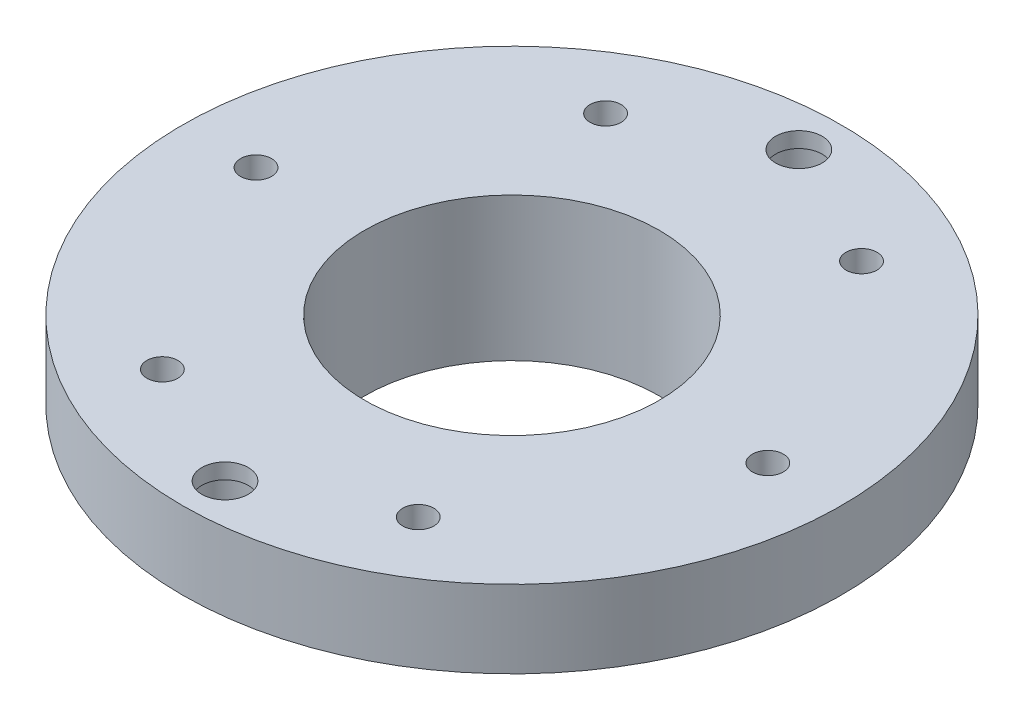
ISO-10303-21;
HEADER;
FILE_DESCRIPTION(('STEP AP214'),'2;1');
FILE_NAME('part.step','',(''),(''),'','','');
FILE_SCHEMA(('AUTOMOTIVE_DESIGN { 1 0 10303 214 1 1 1 1 }'));
ENDSEC;
DATA;
#1=APPLICATION_CONTEXT('core data for automotive mechanical design processes');
#2=APPLICATION_PROTOCOL_DEFINITION('international standard','automotive_design',2000,#1);
#3=PRODUCT_CONTEXT('',#1,'mechanical');
#4=PRODUCT('Part','Part','',(#3));
#5=PRODUCT_RELATED_PRODUCT_CATEGORY('part','',(#4));
#6=PRODUCT_DEFINITION_FORMATION('','',#4);
#7=PRODUCT_DEFINITION_CONTEXT('part definition',#1,'design');
#8=PRODUCT_DEFINITION('design','',#6,#7);
#9=PRODUCT_DEFINITION_SHAPE('','',#8);
#10=(LENGTH_UNIT() NAMED_UNIT(*) SI_UNIT(.MILLI.,.METRE.));
#11=(NAMED_UNIT(*) PLANE_ANGLE_UNIT() SI_UNIT($,.RADIAN.));
#12=(NAMED_UNIT(*) SI_UNIT($,.STERADIAN.) SOLID_ANGLE_UNIT());
#13=UNCERTAINTY_MEASURE_WITH_UNIT(LENGTH_MEASURE(1.E-05),#10,'distance_accuracy_value','');
#14=(GEOMETRIC_REPRESENTATION_CONTEXT(3) GLOBAL_UNCERTAINTY_ASSIGNED_CONTEXT((#13)) GLOBAL_UNIT_ASSIGNED_CONTEXT((#10,
#11,#12)) REPRESENTATION_CONTEXT('',''));
#15=CARTESIAN_POINT('',(0.,0.,0.));
#16=DIRECTION('',(0.,0.,1.));
#17=DIRECTION('',(1.,0.,0.));
#18=AXIS2_PLACEMENT_3D('',#15,#16,#17);
#19=CARTESIAN_POINT('',(0.,-4.24264068711929,18.5));
#20=DIRECTION('',(0.,1.,0.));
#21=DIRECTION('',(0.,0.,1.));
#22=AXIS2_PLACEMENT_3D('',#19,#20,#21);
#23=CYLINDRICAL_SURFACE('',#22,1.5);
#24=CARTESIAN_POINT('',(0.,5.,18.5));
#25=DIRECTION('',(0.,1.,0.));
#26=DIRECTION('',(0.,0.,-1.));
#27=AXIS2_PLACEMENT_3D('',#24,#25,#26);
#28=CIRCLE('',#27,1.5);
#29=CARTESIAN_POINT('',(0.,5.,17.));
#30=VERTEX_POINT('',#29);
#31=EDGE_CURVE('E61',#30,#30,#28,.T.);
#32=ORIENTED_EDGE('',*,*,#31,.T.);
#33=EDGE_LOOP('',(#32));
#34=FACE_BOUND('',#33,.T.);
#35=CARTESIAN_POINT('',(0.,4.,18.5));
#36=DIRECTION('',(0.,-1.,0.));
#37=DIRECTION('',(0.,0.,-1.));
#38=AXIS2_PLACEMENT_3D('',#35,#36,#37);
#39=CIRCLE('',#38,1.5);
#40=CARTESIAN_POINT('',(0.,4.,17.));
#41=VERTEX_POINT('',#40);
#42=EDGE_CURVE('E58',#41,#41,#39,.F.);
#43=ORIENTED_EDGE('',*,*,#42,.F.);
#44=EDGE_LOOP('',(#43));
#45=FACE_BOUND('',#44,.T.);
#46=ADVANCED_FACE('F39',(#34,#45),#23,.F.);
#47=CARTESIAN_POINT('',(0.,-4.24264068711929,-18.5));
#48=DIRECTION('',(0.,1.,0.));
#49=DIRECTION('',(0.,0.,1.));
#50=AXIS2_PLACEMENT_3D('',#47,#48,#49);
#51=CYLINDRICAL_SURFACE('',#50,1.5);
#52=CARTESIAN_POINT('',(0.,5.,-18.5));
#53=DIRECTION('',(0.,1.,0.));
#54=DIRECTION('',(0.,0.,1.));
#55=AXIS2_PLACEMENT_3D('',#52,#53,#54);
#56=CIRCLE('',#55,1.5);
#57=CARTESIAN_POINT('',(0.,5.,-17.));
#58=VERTEX_POINT('',#57);
#59=EDGE_CURVE('E66',#58,#58,#56,.T.);
#60=ORIENTED_EDGE('',*,*,#59,.T.);
#61=EDGE_LOOP('',(#60));
#62=FACE_BOUND('',#61,.T.);
#63=CARTESIAN_POINT('',(0.,4.,-18.5));
#64=DIRECTION('',(0.,-1.,0.));
#65=DIRECTION('',(0.,0.,-1.));
#66=AXIS2_PLACEMENT_3D('',#63,#64,#65);
#67=CIRCLE('',#66,1.5);
#68=CARTESIAN_POINT('',(0.,4.,-20.));
#69=VERTEX_POINT('',#68);
#70=EDGE_CURVE('E63',#69,#69,#67,.F.);
#71=ORIENTED_EDGE('',*,*,#70,.F.);
#72=EDGE_LOOP('',(#71));
#73=FACE_BOUND('',#72,.T.);
#74=ADVANCED_FACE('F171',(#62,#73),#51,.F.);
#75=CARTESIAN_POINT('',(0.,5.,0.));
#76=DIRECTION('',(0.,-1.,0.));
#77=DIRECTION('',(0.,0.,-1.));
#78=AXIS2_PLACEMENT_3D('',#75,#76,#77);
#79=CYLINDRICAL_SURFACE('',#78,21.25);
#80=CARTESIAN_POINT('',(0.,5.,0.));
#81=DIRECTION('',(0.,1.,0.));
#82=DIRECTION('',(0.,0.,1.));
#83=AXIS2_PLACEMENT_3D('',#80,#81,#82);
#84=CIRCLE('',#83,21.25);
#85=CARTESIAN_POINT('',(0.,5.,21.25));
#86=VERTEX_POINT('',#85);
#87=EDGE_CURVE('E71',#86,#86,#84,.T.);
#88=ORIENTED_EDGE('',*,*,#87,.F.);
#89=EDGE_LOOP('',(#88));
#90=FACE_BOUND('',#89,.T.);
#91=CARTESIAN_POINT('',(0.,0.,0.));
#92=DIRECTION('',(0.,1.,0.));
#93=DIRECTION('',(0.,0.,1.));
#94=AXIS2_PLACEMENT_3D('',#91,#92,#93);
#95=CIRCLE('',#94,21.25);
#96=CARTESIAN_POINT('',(0.,0.,21.25));
#97=VERTEX_POINT('',#96);
#98=EDGE_CURVE('E68',#97,#97,#95,.T.);
#99=ORIENTED_EDGE('',*,*,#98,.T.);
#100=EDGE_LOOP('',(#99));
#101=FACE_BOUND('',#100,.T.);
#102=ADVANCED_FACE('F149',(#90,#101),#79,.T.);
#103=CARTESIAN_POINT('',(0.,5.,0.));
#104=DIRECTION('',(0.,1.,0.));
#105=DIRECTION('',(0.,0.,1.));
#106=AXIS2_PLACEMENT_3D('',#103,#104,#105);
#107=PLANE('',#106);
#108=CARTESIAN_POINT('',(-8.25000000000012,5.,-14.2894191624432));
#109=DIRECTION('',(0.,1.,0.));
#110=DIRECTION('',(0.86602540378444,0.,0.499999999999998));
#111=AXIS2_PLACEMENT_3D('',#108,#109,#110);
#112=CIRCLE('',#111,1.);
#113=CARTESIAN_POINT('',(-7.38397459621568,5.,-13.7894191624432));
#114=VERTEX_POINT('',#113);
#115=EDGE_CURVE('E130',#114,#114,#112,.T.);
#116=ORIENTED_EDGE('',*,*,#115,.F.);
#117=EDGE_LOOP('',(#116));
#118=FACE_BOUND('',#117,.T.);
#119=CARTESIAN_POINT('',(-16.5,5.,1.80411241501588E-13));
#120=DIRECTION('',(0.,1.,0.));
#121=DIRECTION('',(0.866025403784436,0.,-0.500000000000004));
#122=AXIS2_PLACEMENT_3D('',#119,#120,#121);
#123=CIRCLE('',#122,1.);
#124=CARTESIAN_POINT('',(-15.6339745962156,5.,-0.499999999999825));
#125=VERTEX_POINT('',#124);
#126=EDGE_CURVE('E124',#125,#125,#123,.T.);
#127=ORIENTED_EDGE('',*,*,#126,.F.);
#128=EDGE_LOOP('',(#127));
#129=FACE_BOUND('',#128,.T.);
#130=CARTESIAN_POINT('',(-8.24999999999991,5.,14.2894191624433));
#131=DIRECTION('',(0.,1.,0.));
#132=DIRECTION('',(0.,0.,-1.));
#133=AXIS2_PLACEMENT_3D('',#130,#131,#132);
#134=CIRCLE('',#133,1.);
#135=CARTESIAN_POINT('',(-8.24999999999991,5.,13.2894191624433));
#136=VERTEX_POINT('',#135);
#137=EDGE_CURVE('E118',#136,#136,#134,.T.);
#138=ORIENTED_EDGE('',*,*,#137,.F.);
#139=EDGE_LOOP('',(#138));
#140=FACE_BOUND('',#139,.T.);
#141=CARTESIAN_POINT('',(8.25000000000022,5.,14.2894191624431));
#142=DIRECTION('',(0.,1.,0.));
#143=DIRECTION('',(-0.866025403784443,0.,-0.499999999999992));
#144=AXIS2_PLACEMENT_3D('',#141,#142,#143);
#145=CIRCLE('',#144,1.);
#146=CARTESIAN_POINT('',(7.38397459621578,5.,13.7894191624431));
#147=VERTEX_POINT('',#146);
#148=EDGE_CURVE('E112',#147,#147,#145,.T.);
#149=ORIENTED_EDGE('',*,*,#148,.F.);
#150=EDGE_LOOP('',(#149));
#151=FACE_BOUND('',#150,.T.);
#152=CARTESIAN_POINT('',(16.5,5.,-2.95770352654046E-13));
#153=DIRECTION('',(0.,1.,0.));
#154=DIRECTION('',(-0.866025403784433,0.,0.50000000000001));
#155=AXIS2_PLACEMENT_3D('',#152,#153,#154);
#156=CIRCLE('',#155,1.);
#157=CARTESIAN_POINT('',(15.6339745962156,5.,0.499999999999716));
#158=VERTEX_POINT('',#157);
#159=EDGE_CURVE('E106',#158,#158,#156,.T.);
#160=ORIENTED_EDGE('',*,*,#159,.F.);
#161=EDGE_LOOP('',(#160));
#162=FACE_BOUND('',#161,.T.);
#163=CARTESIAN_POINT('',(8.24999999999991,5.,-14.2894191624433));
#164=DIRECTION('',(0.,1.,0.));
#165=DIRECTION('',(0.,0.,1.));
#166=AXIS2_PLACEMENT_3D('',#163,#164,#165);
#167=CIRCLE('',#166,1.);
#168=CARTESIAN_POINT('',(8.24999999999991,5.,-13.2894191624433));
#169=VERTEX_POINT('',#168);
#170=EDGE_CURVE('E100',#169,#169,#167,.T.);
#171=ORIENTED_EDGE('',*,*,#170,.F.);
#172=EDGE_LOOP('',(#171));
#173=FACE_BOUND('',#172,.T.);
#174=CARTESIAN_POINT('',(0.,5.,0.));
#175=DIRECTION('',(0.,1.,0.));
#176=DIRECTION('',(0.,0.,1.));
#177=AXIS2_PLACEMENT_3D('',#174,#175,#176);
#178=CIRCLE('',#177,9.5);
#179=CARTESIAN_POINT('',(0.,5.,-9.5));
#180=VERTEX_POINT('',#179);
#181=EDGE_CURVE('E92',#180,#180,#178,.F.);
#182=ORIENTED_EDGE('',*,*,#181,.T.);
#183=EDGE_LOOP('',(#182));
#184=FACE_BOUND('',#183,.T.);
#185=ORIENTED_EDGE('',*,*,#31,.F.);
#186=EDGE_LOOP('',(#185));
#187=FACE_BOUND('',#186,.T.);
#188=ORIENTED_EDGE('',*,*,#59,.F.);
#189=EDGE_LOOP('',(#188));
#190=FACE_BOUND('',#189,.T.);
#191=ORIENTED_EDGE('',*,*,#87,.T.);
#192=EDGE_LOOP('',(#191));
#193=FACE_BOUND('',#192,.T.);
#194=ADVANCED_FACE('F145',(#118,#129,#140,#151,#162,#173,#184,#187,#190,#193),#107,.T.);
#195=CARTESIAN_POINT('',(0.,0.,0.));
#196=DIRECTION('',(0.,1.,0.));
#197=DIRECTION('',(0.,0.,1.));
#198=AXIS2_PLACEMENT_3D('',#195,#196,#197);
#199=PLANE('',#198);
#200=CARTESIAN_POINT('',(0.,0.,0.));
#201=DIRECTION('',(0.,-1.,0.));
#202=DIRECTION('',(0.,0.,-1.));
#203=AXIS2_PLACEMENT_3D('',#200,#201,#202);
#204=CIRCLE('',#203,14.);
#205=CARTESIAN_POINT('',(0.,0.,-14.));
#206=VERTEX_POINT('',#205);
#207=EDGE_CURVE('E55',#206,#206,#204,.T.);
#208=ORIENTED_EDGE('',*,*,#207,.F.);
#209=EDGE_LOOP('',(#208));
#210=FACE_BOUND('',#209,.T.);
#211=CARTESIAN_POINT('',(0.,0.,18.5));
#212=DIRECTION('',(0.,-1.,0.));
#213=DIRECTION('',(0.,0.,1.));
#214=AXIS2_PLACEMENT_3D('',#211,#212,#213);
#215=CIRCLE('',#214,2.);
#216=CARTESIAN_POINT('',(0.,0.,20.5));
#217=VERTEX_POINT('',#216);
#218=EDGE_CURVE('E83',#217,#217,#215,.T.);
#219=ORIENTED_EDGE('',*,*,#218,.F.);
#220=EDGE_LOOP('',(#219));
#221=FACE_BOUND('',#220,.T.);
#222=CARTESIAN_POINT('',(0.,0.,-18.5));
#223=DIRECTION('',(0.,-1.,0.));
#224=DIRECTION('',(0.,0.,-1.));
#225=AXIS2_PLACEMENT_3D('',#222,#223,#224);
#226=CIRCLE('',#225,2.);
#227=CARTESIAN_POINT('',(0.,0.,-20.5));
#228=VERTEX_POINT('',#227);
#229=EDGE_CURVE('E76',#228,#228,#226,.T.);
#230=ORIENTED_EDGE('',*,*,#229,.F.);
#231=EDGE_LOOP('',(#230));
#232=FACE_BOUND('',#231,.T.);
#233=ORIENTED_EDGE('',*,*,#98,.F.);
#234=EDGE_LOOP('',(#233));
#235=FACE_BOUND('',#234,.T.);
#236=ADVANCED_FACE('F148',(#210,#221,#232,#235),#199,.F.);
#237=CARTESIAN_POINT('',(0.,4.,-18.5));
#238=DIRECTION('',(0.,-1.,0.));
#239=DIRECTION('',(0.,0.,-1.));
#240=AXIS2_PLACEMENT_3D('',#237,#238,#239);
#241=PLANE('',#240);
#242=CARTESIAN_POINT('',(0.,4.,-18.5));
#243=DIRECTION('',(0.,-1.,0.));
#244=DIRECTION('',(0.,0.,-1.));
#245=AXIS2_PLACEMENT_3D('',#242,#243,#244);
#246=CIRCLE('',#245,2.);
#247=CARTESIAN_POINT('',(0.,4.,-20.5));
#248=VERTEX_POINT('',#247);
#249=EDGE_CURVE('E67',#248,#248,#246,.T.);
#250=ORIENTED_EDGE('',*,*,#249,.T.);
#251=EDGE_LOOP('',(#250));
#252=FACE_BOUND('',#251,.T.);
#253=ORIENTED_EDGE('',*,*,#70,.T.);
#254=EDGE_LOOP('',(#253));
#255=FACE_BOUND('',#254,.T.);
#256=ADVANCED_FACE('F175',(#252,#255),#241,.T.);
#257=CARTESIAN_POINT('',(0.,4.,-18.5));
#258=DIRECTION('',(0.,-1.,0.));
#259=DIRECTION('',(0.,0.,-1.));
#260=AXIS2_PLACEMENT_3D('',#257,#258,#259);
#261=CYLINDRICAL_SURFACE('',#260,2.);
#262=ORIENTED_EDGE('',*,*,#249,.F.);
#263=EDGE_LOOP('',(#262));
#264=FACE_BOUND('',#263,.T.);
#265=ORIENTED_EDGE('',*,*,#229,.T.);
#266=EDGE_LOOP('',(#265));
#267=FACE_BOUND('',#266,.T.);
#268=ADVANCED_FACE('F183',(#264,#267),#261,.F.);
#269=CARTESIAN_POINT('',(0.,4.,18.5));
#270=DIRECTION('',(0.,-1.,0.));
#271=DIRECTION('',(0.,0.,1.));
#272=AXIS2_PLACEMENT_3D('',#269,#270,#271);
#273=PLANE('',#272);
#274=CARTESIAN_POINT('',(0.,4.,18.5));
#275=DIRECTION('',(0.,-1.,0.));
#276=DIRECTION('',(0.,0.,1.));
#277=AXIS2_PLACEMENT_3D('',#274,#275,#276);
#278=CIRCLE('',#277,2.);
#279=CARTESIAN_POINT('',(0.,4.,20.5));
#280=VERTEX_POINT('',#279);
#281=EDGE_CURVE('E62',#280,#280,#278,.T.);
#282=ORIENTED_EDGE('',*,*,#281,.T.);
#283=EDGE_LOOP('',(#282));
#284=FACE_BOUND('',#283,.T.);
#285=ORIENTED_EDGE('',*,*,#42,.T.);
#286=EDGE_LOOP('',(#285));
#287=FACE_BOUND('',#286,.T.);
#288=ADVANCED_FACE('F203',(#284,#287),#273,.T.);
#289=CARTESIAN_POINT('',(0.,4.,18.5));
#290=DIRECTION('',(0.,-1.,0.));
#291=DIRECTION('',(0.,0.,-1.));
#292=AXIS2_PLACEMENT_3D('',#289,#290,#291);
#293=CYLINDRICAL_SURFACE('',#292,2.);
#294=ORIENTED_EDGE('',*,*,#281,.F.);
#295=EDGE_LOOP('',(#294));
#296=FACE_BOUND('',#295,.T.);
#297=ORIENTED_EDGE('',*,*,#218,.T.);
#298=EDGE_LOOP('',(#297));
#299=FACE_BOUND('',#298,.T.);
#300=ADVANCED_FACE('F200',(#296,#299),#293,.F.);
#301=CARTESIAN_POINT('',(0.,-0.25,0.));
#302=DIRECTION('',(0.,1.,0.));
#303=DIRECTION('',(0.,0.,1.));
#304=AXIS2_PLACEMENT_3D('',#301,#302,#303);
#305=CYLINDRICAL_SURFACE('',#304,14.);
#306=CARTESIAN_POINT('',(0.,-0.25,0.));
#307=DIRECTION('',(0.,-1.,0.));
#308=DIRECTION('',(0.,0.,-1.));
#309=AXIS2_PLACEMENT_3D('',#306,#307,#308);
#310=CIRCLE('',#309,14.);
#311=CARTESIAN_POINT('',(0.,-0.25,-14.));
#312=VERTEX_POINT('',#311);
#313=EDGE_CURVE('E86',#312,#312,#310,.T.);
#314=ORIENTED_EDGE('',*,*,#313,.F.);
#315=EDGE_LOOP('',(#314));
#316=FACE_BOUND('',#315,.T.);
#317=ORIENTED_EDGE('',*,*,#207,.T.);
#318=EDGE_LOOP('',(#317));
#319=FACE_BOUND('',#318,.T.);
#320=ADVANCED_FACE('F217',(#316,#319),#305,.T.);
#321=CARTESIAN_POINT('',(0.,-0.25,0.));
#322=DIRECTION('',(0.,-1.,0.));
#323=DIRECTION('',(0.,0.,-1.));
#324=AXIS2_PLACEMENT_3D('',#321,#322,#323);
#325=PLANE('',#324);
#326=CARTESIAN_POINT('',(0.,-0.25,0.));
#327=DIRECTION('',(0.,-1.,0.));
#328=DIRECTION('',(0.,0.,-1.));
#329=AXIS2_PLACEMENT_3D('',#326,#327,#328);
#330=CIRCLE('',#329,12.575);
#331=CARTESIAN_POINT('',(0.,-0.25,-12.575));
#332=VERTEX_POINT('',#331);
#333=EDGE_CURVE('E51',#332,#332,#330,.T.);
#334=ORIENTED_EDGE('',*,*,#333,.F.);
#335=EDGE_LOOP('',(#334));
#336=FACE_BOUND('',#335,.T.);
#337=ORIENTED_EDGE('',*,*,#313,.T.);
#338=EDGE_LOOP('',(#337));
#339=FACE_BOUND('',#338,.T.);
#340=ADVANCED_FACE('F222',(#336,#339),#325,.T.);
#341=CARTESIAN_POINT('',(0.,-4.25,0.));
#342=DIRECTION('',(0.,1.,0.));
#343=DIRECTION('',(0.,0.,1.));
#344=AXIS2_PLACEMENT_3D('',#341,#342,#343);
#345=CYLINDRICAL_SURFACE('',#344,12.575);
#346=CARTESIAN_POINT('',(0.,-3.74999999999999,0.));
#347=DIRECTION('',(0.,-1.,0.));
#348=DIRECTION('',(0.,0.,-1.));
#349=AXIS2_PLACEMENT_3D('',#346,#347,#348);
#350=CIRCLE('',#349,12.575);
#351=CARTESIAN_POINT('',(0.,-3.74999999999999,-12.575));
#352=VERTEX_POINT('',#351);
#353=EDGE_CURVE('E10',#352,#352,#350,.F.);
#354=ORIENTED_EDGE('',*,*,#353,.T.);
#355=EDGE_LOOP('',(#354));
#356=FACE_BOUND('',#355,.T.);
#357=ORIENTED_EDGE('',*,*,#333,.T.);
#358=EDGE_LOOP('',(#357));
#359=FACE_BOUND('',#358,.T.);
#360=ADVANCED_FACE('F226',(#356,#359),#345,.T.);
#361=CARTESIAN_POINT('',(0.,-4.25,0.));
#362=DIRECTION('',(0.,-1.,0.));
#363=DIRECTION('',(0.,0.,-1.));
#364=AXIS2_PLACEMENT_3D('',#361,#362,#363);
#365=PLANE('',#364);
#366=CARTESIAN_POINT('',(0.,-4.25,0.));
#367=DIRECTION('',(0.,-1.,0.));
#368=DIRECTION('',(0.,0.,-1.));
#369=AXIS2_PLACEMENT_3D('',#366,#367,#368);
#370=CIRCLE('',#369,9.5);
#371=CARTESIAN_POINT('',(0.,-4.25,-9.5));
#372=VERTEX_POINT('',#371);
#373=EDGE_CURVE('E96',#372,#372,#370,.T.);
#374=ORIENTED_EDGE('',*,*,#373,.F.);
#375=EDGE_LOOP('',(#374));
#376=FACE_BOUND('',#375,.T.);
#377=CARTESIAN_POINT('',(0.,-4.25,0.));
#378=DIRECTION('',(0.,-1.,0.));
#379=DIRECTION('',(0.,0.,-1.));
#380=AXIS2_PLACEMENT_3D('',#377,#378,#379);
#381=CIRCLE('',#380,12.075);
#382=CARTESIAN_POINT('',(0.,-4.25,-12.075));
#383=VERTEX_POINT('',#382);
#384=EDGE_CURVE('E47',#383,#383,#381,.T.);
#385=ORIENTED_EDGE('',*,*,#384,.T.);
#386=EDGE_LOOP('',(#385));
#387=FACE_BOUND('',#386,.T.);
#388=ADVANCED_FACE('F230',(#376,#387),#365,.T.);
#389=CARTESIAN_POINT('',(0.,-4.25,0.));
#390=DIRECTION('',(0.,1.,0.));
#391=DIRECTION('',(0.,0.,1.));
#392=AXIS2_PLACEMENT_3D('',#389,#390,#391);
#393=CONICAL_SURFACE('',#392,12.075,0.785398163397445);
#394=ORIENTED_EDGE('',*,*,#353,.F.);
#395=EDGE_LOOP('',(#394));
#396=FACE_BOUND('',#395,.T.);
#397=ORIENTED_EDGE('',*,*,#384,.F.);
#398=EDGE_LOOP('',(#397));
#399=FACE_BOUND('',#398,.T.);
#400=ADVANCED_FACE('F42',(#396,#399),#393,.T.);
#401=CARTESIAN_POINT('',(0.,31.8700576850888,0.));
#402=DIRECTION('',(0.,-1.,0.));
#403=DIRECTION('',(0.,0.,-1.));
#404=AXIS2_PLACEMENT_3D('',#401,#402,#403);
#405=CYLINDRICAL_SURFACE('',#404,9.5);
#406=CARTESIAN_POINT('',(0.,-4.25,-9.5));
#407=CARTESIAN_POINT('',(0.,-4.15364583333333,-9.5));
#408=CARTESIAN_POINT('',(0.,-4.05729166666666,-9.5));
#409=CARTESIAN_POINT('',(0.,-3.86458333333333,-9.5));
#410=CARTESIAN_POINT('',(0.,-3.76822916666666,-9.5));
#411=CARTESIAN_POINT('',(0.,-3.57552083333333,-9.5));
#412=CARTESIAN_POINT('',(0.,-3.47916666666667,-9.5));
#413=CARTESIAN_POINT('',(0.,-3.28645833333333,-9.5));
#414=CARTESIAN_POINT('',(0.,-3.19010416666667,-9.5));
#415=CARTESIAN_POINT('',(0.,-2.99739583333333,-9.5));
#416=CARTESIAN_POINT('',(0.,-2.90104166666667,-9.5));
#417=CARTESIAN_POINT('',(0.,-2.70833333333333,-9.5));
#418=CARTESIAN_POINT('',(0.,-2.61197916666666,-9.5));
#419=CARTESIAN_POINT('',(0.,-2.41927083333333,-9.5));
#420=CARTESIAN_POINT('',(0.,-2.32291666666666,-9.5));
#421=CARTESIAN_POINT('',(0.,-2.13020833333333,-9.5));
#422=CARTESIAN_POINT('',(0.,-2.03385416666666,-9.5));
#423=CARTESIAN_POINT('',(0.,-1.84114583333333,-9.5));
#424=CARTESIAN_POINT('',(0.,-1.74479166666666,-9.5));
#425=CARTESIAN_POINT('',(0.,-1.55208333333333,-9.5));
#426=CARTESIAN_POINT('',(0.,-1.45572916666666,-9.5));
#427=CARTESIAN_POINT('',(0.,-1.26302083333333,-9.5));
#428=CARTESIAN_POINT('',(0.,-1.16666666666666,-9.5));
#429=CARTESIAN_POINT('',(0.,-0.97395833333333,-9.5));
#430=CARTESIAN_POINT('',(0.,-0.877604166666664,-9.5));
#431=CARTESIAN_POINT('',(0.,-0.684895833333331,-9.5));
#432=CARTESIAN_POINT('',(0.,-0.588541666666664,-9.5));
#433=CARTESIAN_POINT('',(0.,-0.395833333333331,-9.5));
#434=CARTESIAN_POINT('',(0.,-0.299479166666665,-9.5));
#435=CARTESIAN_POINT('',(0.,-0.106770833333332,-9.5));
#436=CARTESIAN_POINT('',(0.,-0.0104166666666655,-9.5));
#437=CARTESIAN_POINT('',(0.,0.18229166666667,-9.5));
#438=CARTESIAN_POINT('',(0.,0.278645833333338,-9.5));
#439=CARTESIAN_POINT('',(0.,0.471354166666671,-9.5));
#440=CARTESIAN_POINT('',(0.,0.567708333333336,-9.5));
#441=CARTESIAN_POINT('',(0.,0.760416666666667,-9.5));
#442=CARTESIAN_POINT('',(0.,0.856770833333335,-9.5));
#443=CARTESIAN_POINT('',(0.,1.04947916666667,-9.5));
#444=CARTESIAN_POINT('',(0.,1.14583333333334,-9.5));
#445=CARTESIAN_POINT('',(0.,1.33854166666667,-9.5));
#446=CARTESIAN_POINT('',(0.,1.43489583333333,-9.5));
#447=CARTESIAN_POINT('',(0.,1.62760416666667,-9.5));
#448=CARTESIAN_POINT('',(0.,1.72395833333333,-9.5));
#449=CARTESIAN_POINT('',(0.,1.91666666666667,-9.5));
#450=CARTESIAN_POINT('',(0.,2.01302083333333,-9.5));
#451=CARTESIAN_POINT('',(0.,2.20572916666667,-9.5));
#452=CARTESIAN_POINT('',(0.,2.30208333333333,-9.5));
#453=CARTESIAN_POINT('',(0.,2.49479166666667,-9.5));
#454=CARTESIAN_POINT('',(0.,2.59114583333333,-9.5));
#455=CARTESIAN_POINT('',(0.,2.78385416666667,-9.5));
#456=CARTESIAN_POINT('',(0.,2.88020833333333,-9.5));
#457=CARTESIAN_POINT('',(0.,3.07291666666667,-9.5));
#458=CARTESIAN_POINT('',(0.,3.16927083333333,-9.5));
#459=CARTESIAN_POINT('',(0.,3.36197916666667,-9.5));
#460=CARTESIAN_POINT('',(0.,3.45833333333333,-9.5));
#461=CARTESIAN_POINT('',(0.,3.65104166666667,-9.5));
#462=CARTESIAN_POINT('',(0.,3.74739583333333,-9.5));
#463=CARTESIAN_POINT('',(0.,3.94010416666667,-9.5));
#464=CARTESIAN_POINT('',(0.,4.03645833333334,-9.5));
#465=CARTESIAN_POINT('',(0.,4.22916666666667,-9.5));
#466=CARTESIAN_POINT('',(0.,4.32552083333334,-9.5));
#467=CARTESIAN_POINT('',(0.,4.51822916666667,-9.5));
#468=CARTESIAN_POINT('',(0.,4.61458333333333,-9.5));
#469=CARTESIAN_POINT('',(0.,4.80729166666667,-9.5));
#470=CARTESIAN_POINT('',(0.,4.90364583333333,-9.5));
#471=CARTESIAN_POINT('',(0.,5.,-9.5));
#472=B_SPLINE_CURVE_WITH_KNOTS('',3,(#406,#407,#408,#409,#410,#411,#412,#413,#414,#415,#416,
#417,#418,#419,#420,#421,#422,#423,#424,#425,#426,#427,#428,#429,#430,#431,#432,#433,#434,#435,
#436,#437,#438,#439,#440,#441,#442,#443,#444,#445,#446,#447,#448,#449,#450,#451,#452,#453,#454,
#455,#456,#457,#458,#459,#460,#461,#462,#463,#464,#465,#466,#467,#468,#469,#470,#471),
.UNSPECIFIED.,.F.,.F.,(4,2,2,2,2,2,2,2,2,2,2,2,2,2,2,2,2,2,2,2,2,2,2,2,2,2,2,2,2,2,2,2,4),(0.,
0.289062499999999,0.578124999999999,0.867187499999998,1.15625,1.4453125,1.734375,2.0234375,
2.3125,2.6015625,2.890625,3.1796875,3.46875,3.7578125,4.046875,4.3359375,4.625,4.9140625,
5.203125,5.4921875,5.78125,6.0703125,6.359375,6.6484375,6.9375,7.2265625,7.515625,7.8046875,
8.09375,8.3828125,8.671875,8.9609375,9.25),.UNSPECIFIED.);
#473=EDGE_CURVE('BSEAM234',#372,#180,#472,.T.);
#474=ORIENTED_EDGE('',*,*,#373,.T.);
#475=ORIENTED_EDGE('',*,*,#181,.F.);
#476=ORIENTED_EDGE('',*,*,#473,.T.);
#477=ORIENTED_EDGE('',*,*,#473,.F.);
#478=EDGE_LOOP('',(#474,#476,#475,#477));
#479=FACE_BOUND('',#478,.T.);
#480=ADVANCED_FACE('F234',(#479),#405,.F.);
#481=CARTESIAN_POINT('',(8.24999999999991,1.,-14.2894191624433));
#482=DIRECTION('',(0.,1.,0.));
#483=DIRECTION('',(0.,0.,1.));
#484=AXIS2_PLACEMENT_3D('',#481,#482,#483);
#485=CYLINDRICAL_SURFACE('',#484,1.);
#486=CARTESIAN_POINT('',(8.24999999999991,1.,-14.2894191624433));
#487=DIRECTION('',(0.,1.,0.));
#488=DIRECTION('',(0.,0.,1.));
#489=AXIS2_PLACEMENT_3D('',#486,#487,#488);
#490=CIRCLE('',#489,1.);
#491=CARTESIAN_POINT('',(8.24999999999991,1.,-13.2894191624433));
#492=VERTEX_POINT('',#491);
#493=EDGE_CURVE('E99',#492,#492,#490,.T.);
#494=ORIENTED_EDGE('',*,*,#493,.F.);
#495=EDGE_LOOP('',(#494));
#496=FACE_BOUND('',#495,.T.);
#497=ORIENTED_EDGE('',*,*,#170,.T.);
#498=EDGE_LOOP('',(#497));
#499=FACE_BOUND('',#498,.T.);
#500=ADVANCED_FACE('F237',(#496,#499),#485,.F.);
#501=CARTESIAN_POINT('',(8.24999999999991,1.,-14.2894191624433));
#502=DIRECTION('',(0.,1.,0.));
#503=DIRECTION('',(0.,0.,1.));
#504=AXIS2_PLACEMENT_3D('',#501,#502,#503);
#505=PLANE('',#504);
#506=ORIENTED_EDGE('',*,*,#493,.T.);
#507=EDGE_LOOP('',(#506));
#508=FACE_BOUND('',#507,.T.);
#509=ADVANCED_FACE('F241',(#508),#505,.T.);
#510=CARTESIAN_POINT('',(16.5,1.,-2.95770352654046E-13));
#511=DIRECTION('',(0.,1.,0.));
#512=DIRECTION('',(0.,0.,1.));
#513=AXIS2_PLACEMENT_3D('',#510,#511,#512);
#514=CYLINDRICAL_SURFACE('',#513,1.);
#515=CARTESIAN_POINT('',(16.5,1.,-2.95770352654046E-13));
#516=DIRECTION('',(0.,1.,0.));
#517=DIRECTION('',(-0.866025403784433,0.,0.50000000000001));
#518=AXIS2_PLACEMENT_3D('',#515,#516,#517);
#519=CIRCLE('',#518,1.);
#520=CARTESIAN_POINT('',(15.6339745962156,1.,0.499999999999716));
#521=VERTEX_POINT('',#520);
#522=EDGE_CURVE('E109',#521,#521,#519,.T.);
#523=ORIENTED_EDGE('',*,*,#522,.F.);
#524=EDGE_LOOP('',(#523));
#525=FACE_BOUND('',#524,.T.);
#526=ORIENTED_EDGE('',*,*,#159,.T.);
#527=EDGE_LOOP('',(#526));
#528=FACE_BOUND('',#527,.T.);
#529=ADVANCED_FACE('F245',(#525,#528),#514,.F.);
#530=CARTESIAN_POINT('',(16.5,1.,-2.95770352654046E-13));
#531=DIRECTION('',(0.,1.,0.));
#532=DIRECTION('',(-0.866025403784433,0.,0.50000000000001));
#533=AXIS2_PLACEMENT_3D('',#530,#531,#532);
#534=PLANE('',#533);
#535=ORIENTED_EDGE('',*,*,#522,.T.);
#536=EDGE_LOOP('',(#535));
#537=FACE_BOUND('',#536,.T.);
#538=ADVANCED_FACE('F249',(#537),#534,.T.);
#539=CARTESIAN_POINT('',(8.25000000000022,1.,14.2894191624431));
#540=DIRECTION('',(0.,1.,0.));
#541=DIRECTION('',(0.,0.,1.));
#542=AXIS2_PLACEMENT_3D('',#539,#540,#541);
#543=CYLINDRICAL_SURFACE('',#542,1.);
#544=CARTESIAN_POINT('',(8.25000000000022,1.,14.2894191624431));
#545=DIRECTION('',(0.,1.,0.));
#546=DIRECTION('',(-0.866025403784443,0.,-0.499999999999992));
#547=AXIS2_PLACEMENT_3D('',#544,#545,#546);
#548=CIRCLE('',#547,1.);
#549=CARTESIAN_POINT('',(7.38397459621578,1.,13.7894191624431));
#550=VERTEX_POINT('',#549);
#551=EDGE_CURVE('E115',#550,#550,#548,.T.);
#552=ORIENTED_EDGE('',*,*,#551,.F.);
#553=EDGE_LOOP('',(#552));
#554=FACE_BOUND('',#553,.T.);
#555=ORIENTED_EDGE('',*,*,#148,.T.);
#556=EDGE_LOOP('',(#555));
#557=FACE_BOUND('',#556,.T.);
#558=ADVANCED_FACE('F253',(#554,#557),#543,.F.);
#559=CARTESIAN_POINT('',(8.25000000000022,1.,14.2894191624431));
#560=DIRECTION('',(0.,1.,0.));
#561=DIRECTION('',(-0.866025403784443,0.,-0.499999999999992));
#562=AXIS2_PLACEMENT_3D('',#559,#560,#561);
#563=PLANE('',#562);
#564=ORIENTED_EDGE('',*,*,#551,.T.);
#565=EDGE_LOOP('',(#564));
#566=FACE_BOUND('',#565,.T.);
#567=ADVANCED_FACE('F257',(#566),#563,.T.);
#568=CARTESIAN_POINT('',(-8.24999999999991,1.,14.2894191624433));
#569=DIRECTION('',(0.,1.,0.));
#570=DIRECTION('',(0.,0.,1.));
#571=AXIS2_PLACEMENT_3D('',#568,#569,#570);
#572=CYLINDRICAL_SURFACE('',#571,1.);
#573=CARTESIAN_POINT('',(-8.24999999999991,1.,14.2894191624433));
#574=DIRECTION('',(0.,1.,0.));
#575=DIRECTION('',(0.,0.,-1.));
#576=AXIS2_PLACEMENT_3D('',#573,#574,#575);
#577=CIRCLE('',#576,1.);
#578=CARTESIAN_POINT('',(-8.24999999999991,1.,13.2894191624433));
#579=VERTEX_POINT('',#578);
#580=EDGE_CURVE('E121',#579,#579,#577,.T.);
#581=ORIENTED_EDGE('',*,*,#580,.F.);
#582=EDGE_LOOP('',(#581));
#583=FACE_BOUND('',#582,.T.);
#584=ORIENTED_EDGE('',*,*,#137,.T.);
#585=EDGE_LOOP('',(#584));
#586=FACE_BOUND('',#585,.T.);
#587=ADVANCED_FACE('F261',(#583,#586),#572,.F.);
#588=CARTESIAN_POINT('',(-8.24999999999991,1.,14.2894191624433));
#589=DIRECTION('',(0.,1.,0.));
#590=DIRECTION('',(0.,0.,-1.));
#591=AXIS2_PLACEMENT_3D('',#588,#589,#590);
#592=PLANE('',#591);
#593=ORIENTED_EDGE('',*,*,#580,.T.);
#594=EDGE_LOOP('',(#593));
#595=FACE_BOUND('',#594,.T.);
#596=ADVANCED_FACE('F265',(#595),#592,.T.);
#597=CARTESIAN_POINT('',(-16.5,1.,1.80411241501588E-13));
#598=DIRECTION('',(0.,1.,0.));
#599=DIRECTION('',(0.,0.,1.));
#600=AXIS2_PLACEMENT_3D('',#597,#598,#599);
#601=CYLINDRICAL_SURFACE('',#600,1.);
#602=CARTESIAN_POINT('',(-16.5,1.,1.80411241501588E-13));
#603=DIRECTION('',(0.,1.,0.));
#604=DIRECTION('',(0.866025403784436,0.,-0.500000000000004));
#605=AXIS2_PLACEMENT_3D('',#602,#603,#604);
#606=CIRCLE('',#605,1.);
#607=CARTESIAN_POINT('',(-15.6339745962156,1.,-0.499999999999825));
#608=VERTEX_POINT('',#607);
#609=EDGE_CURVE('E127',#608,#608,#606,.T.);
#610=ORIENTED_EDGE('',*,*,#609,.F.);
#611=EDGE_LOOP('',(#610));
#612=FACE_BOUND('',#611,.T.);
#613=ORIENTED_EDGE('',*,*,#126,.T.);
#614=EDGE_LOOP('',(#613));
#615=FACE_BOUND('',#614,.T.);
#616=ADVANCED_FACE('F269',(#612,#615),#601,.F.);
#617=CARTESIAN_POINT('',(-16.5,1.,1.80411241501588E-13));
#618=DIRECTION('',(0.,1.,0.));
#619=DIRECTION('',(0.866025403784436,0.,-0.500000000000004));
#620=AXIS2_PLACEMENT_3D('',#617,#618,#619);
#621=PLANE('',#620);
#622=ORIENTED_EDGE('',*,*,#609,.T.);
#623=EDGE_LOOP('',(#622));
#624=FACE_BOUND('',#623,.T.);
#625=ADVANCED_FACE('F141',(#624),#621,.T.);
#626=CARTESIAN_POINT('',(-8.25000000000012,1.,-14.2894191624432));
#627=DIRECTION('',(0.,1.,0.));
#628=DIRECTION('',(0.,0.,1.));
#629=AXIS2_PLACEMENT_3D('',#626,#627,#628);
#630=CYLINDRICAL_SURFACE('',#629,1.);
#631=CARTESIAN_POINT('',(-8.25000000000012,1.,-14.2894191624432));
#632=DIRECTION('',(0.,1.,0.));
#633=DIRECTION('',(0.86602540378444,0.,0.499999999999998));
#634=AXIS2_PLACEMENT_3D('',#631,#632,#633);
#635=CIRCLE('',#634,1.);
#636=CARTESIAN_POINT('',(-7.38397459621568,1.,-13.7894191624432));
#637=VERTEX_POINT('',#636);
#638=EDGE_CURVE('E103',#637,#637,#635,.T.);
#639=ORIENTED_EDGE('',*,*,#638,.F.);
#640=EDGE_LOOP('',(#639));
#641=FACE_BOUND('',#640,.T.);
#642=ORIENTED_EDGE('',*,*,#115,.T.);
#643=EDGE_LOOP('',(#642));
#644=FACE_BOUND('',#643,.T.);
#645=ADVANCED_FACE('F138',(#641,#644),#630,.F.);
#646=CARTESIAN_POINT('',(-8.25000000000012,1.,-14.2894191624432));
#647=DIRECTION('',(0.,1.,0.));
#648=DIRECTION('',(0.86602540378444,0.,0.499999999999998));
#649=AXIS2_PLACEMENT_3D('',#646,#647,#648);
#650=PLANE('',#649);
#651=ORIENTED_EDGE('',*,*,#638,.T.);
#652=EDGE_LOOP('',(#651));
#653=FACE_BOUND('',#652,.T.);
#654=ADVANCED_FACE('F136',(#653),#650,.T.);
#655=CLOSED_SHELL('',(#46,#74,#102,#194,#236,#256,#268,#288,#300,#320,#340,#360,#388,#400,#480,
#500,#509,#529,#538,#558,#567,#587,#596,#616,#625,#645,#654));
#656=MANIFOLD_SOLID_BREP('B2',#655);
#657=ADVANCED_BREP_SHAPE_REPRESENTATION('',(#18,#656),#14);
#658=SHAPE_DEFINITION_REPRESENTATION(#9,#657);
ENDSEC;
END-ISO-10303-21;
